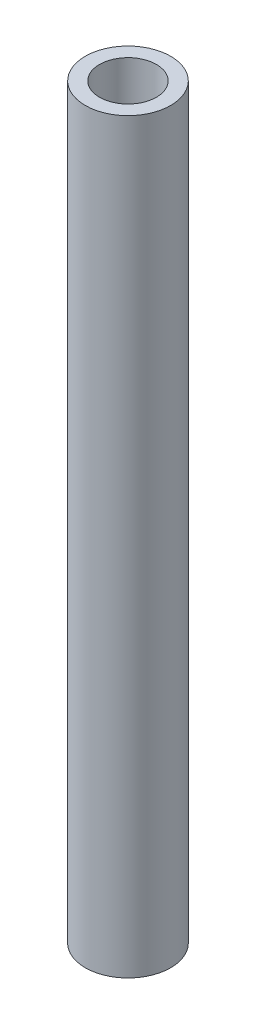
ISO-10303-21;
HEADER;
FILE_DESCRIPTION(('STEP AP214'),'2;1');
FILE_NAME('part.step','',(''),(''),'','','');
FILE_SCHEMA(('AUTOMOTIVE_DESIGN { 1 0 10303 214 1 1 1 1 }'));
ENDSEC;
DATA;
#1=APPLICATION_CONTEXT('core data for automotive mechanical design processes');
#2=APPLICATION_PROTOCOL_DEFINITION('international standard','automotive_design',2000,#1);
#3=PRODUCT_CONTEXT('',#1,'mechanical');
#4=PRODUCT('Part','Part','',(#3));
#5=PRODUCT_RELATED_PRODUCT_CATEGORY('part','',(#4));
#6=PRODUCT_DEFINITION_FORMATION('','',#4);
#7=PRODUCT_DEFINITION_CONTEXT('part definition',#1,'design');
#8=PRODUCT_DEFINITION('design','',#6,#7);
#9=PRODUCT_DEFINITION_SHAPE('','',#8);
#10=(LENGTH_UNIT() NAMED_UNIT(*) SI_UNIT(.MILLI.,.METRE.));
#11=(NAMED_UNIT(*) PLANE_ANGLE_UNIT() SI_UNIT($,.RADIAN.));
#12=(NAMED_UNIT(*) SI_UNIT($,.STERADIAN.) SOLID_ANGLE_UNIT());
#13=UNCERTAINTY_MEASURE_WITH_UNIT(LENGTH_MEASURE(1.E-05),#10,'distance_accuracy_value','');
#14=(GEOMETRIC_REPRESENTATION_CONTEXT(3) GLOBAL_UNCERTAINTY_ASSIGNED_CONTEXT((#13)) GLOBAL_UNIT_ASSIGNED_CONTEXT((#10,
#11,#12)) REPRESENTATION_CONTEXT('',''));
#15=CARTESIAN_POINT('',(0.,0.,0.));
#16=DIRECTION('',(0.,0.,1.));
#17=DIRECTION('',(1.,0.,0.));
#18=AXIS2_PLACEMENT_3D('',#15,#16,#17);
#19=CARTESIAN_POINT('',(0.,52.5,0.));
#20=DIRECTION('',(0.,1.,0.));
#21=DIRECTION('',(0.,0.,1.));
#22=AXIS2_PLACEMENT_3D('',#19,#20,#21);
#23=PLANE('',#22);
#24=CARTESIAN_POINT('',(0.,52.5,0.));
#25=DIRECTION('',(0.,1.,0.));
#26=DIRECTION('',(0.,0.,1.));
#27=AXIS2_PLACEMENT_3D('',#24,#25,#26);
#28=CIRCLE('',#27,3.);
#29=CARTESIAN_POINT('',(0.,52.5,3.));
#30=VERTEX_POINT('',#29);
#31=EDGE_CURVE('E10',#30,#30,#28,.T.);
#32=ORIENTED_EDGE('',*,*,#31,.T.);
#33=EDGE_LOOP('',(#32));
#34=FACE_BOUND('',#33,.T.);
#35=CARTESIAN_POINT('',(0.,52.5,0.));
#36=DIRECTION('',(0.,1.,0.));
#37=DIRECTION('',(0.,0.,1.));
#38=AXIS2_PLACEMENT_3D('',#35,#36,#37);
#39=CIRCLE('',#38,2.);
#40=CARTESIAN_POINT('',(0.,52.5,2.));
#41=VERTEX_POINT('',#40);
#42=EDGE_CURVE('E58',#41,#41,#39,.T.);
#43=ORIENTED_EDGE('',*,*,#42,.F.);
#44=EDGE_LOOP('',(#43));
#45=FACE_BOUND('',#44,.T.);
#46=ADVANCED_FACE('F47',(#34,#45),#23,.T.);
#47=CARTESIAN_POINT('',(0.,0.,0.));
#48=DIRECTION('',(0.,1.,0.));
#49=DIRECTION('',(0.,0.,1.));
#50=AXIS2_PLACEMENT_3D('',#47,#48,#49);
#51=PLANE('',#50);
#52=CARTESIAN_POINT('',(0.,0.,0.));
#53=DIRECTION('',(0.,1.,0.));
#54=DIRECTION('',(0.,0.,1.));
#55=AXIS2_PLACEMENT_3D('',#52,#53,#54);
#56=CIRCLE('',#55,3.);
#57=CARTESIAN_POINT('',(0.,0.,3.));
#58=VERTEX_POINT('',#57);
#59=EDGE_CURVE('E51',#58,#58,#56,.T.);
#60=ORIENTED_EDGE('',*,*,#59,.F.);
#61=EDGE_LOOP('',(#60));
#62=FACE_BOUND('',#61,.T.);
#63=CARTESIAN_POINT('',(0.,0.,0.));
#64=DIRECTION('',(0.,1.,0.));
#65=DIRECTION('',(0.,0.,1.));
#66=AXIS2_PLACEMENT_3D('',#63,#64,#65);
#67=CIRCLE('',#66,2.);
#68=CARTESIAN_POINT('',(0.,0.,2.));
#69=VERTEX_POINT('',#68);
#70=EDGE_CURVE('E60',#69,#69,#67,.T.);
#71=ORIENTED_EDGE('',*,*,#70,.T.);
#72=EDGE_LOOP('',(#71));
#73=FACE_BOUND('',#72,.T.);
#74=ADVANCED_FACE('F70',(#62,#73),#51,.F.);
#75=CARTESIAN_POINT('',(0.,52.5,0.));
#76=DIRECTION('',(0.,-1.,0.));
#77=DIRECTION('',(0.,0.,-1.));
#78=AXIS2_PLACEMENT_3D('',#75,#76,#77);
#79=CYLINDRICAL_SURFACE('',#78,3.);
#80=ORIENTED_EDGE('',*,*,#31,.F.);
#81=EDGE_LOOP('',(#80));
#82=FACE_BOUND('',#81,.T.);
#83=ORIENTED_EDGE('',*,*,#59,.T.);
#84=EDGE_LOOP('',(#83));
#85=FACE_BOUND('',#84,.T.);
#86=ADVANCED_FACE('F49',(#82,#85),#79,.T.);
#87=CARTESIAN_POINT('',(0.,52.5,0.));
#88=DIRECTION('',(0.,-1.,0.));
#89=DIRECTION('',(0.,0.,-1.));
#90=AXIS2_PLACEMENT_3D('',#87,#88,#89);
#91=CYLINDRICAL_SURFACE('',#90,2.);
#92=ORIENTED_EDGE('',*,*,#42,.T.);
#93=EDGE_LOOP('',(#92));
#94=FACE_BOUND('',#93,.T.);
#95=ORIENTED_EDGE('',*,*,#70,.F.);
#96=EDGE_LOOP('',(#95));
#97=FACE_BOUND('',#96,.T.);
#98=ADVANCED_FACE('F66',(#94,#97),#91,.F.);
#99=CLOSED_SHELL('',(#46,#74,#86,#98));
#100=MANIFOLD_SOLID_BREP('B2',#99);
#101=ADVANCED_BREP_SHAPE_REPRESENTATION('',(#18,#100),#14);
#102=SHAPE_DEFINITION_REPRESENTATION(#9,#101);
ENDSEC;
END-ISO-10303-21;
